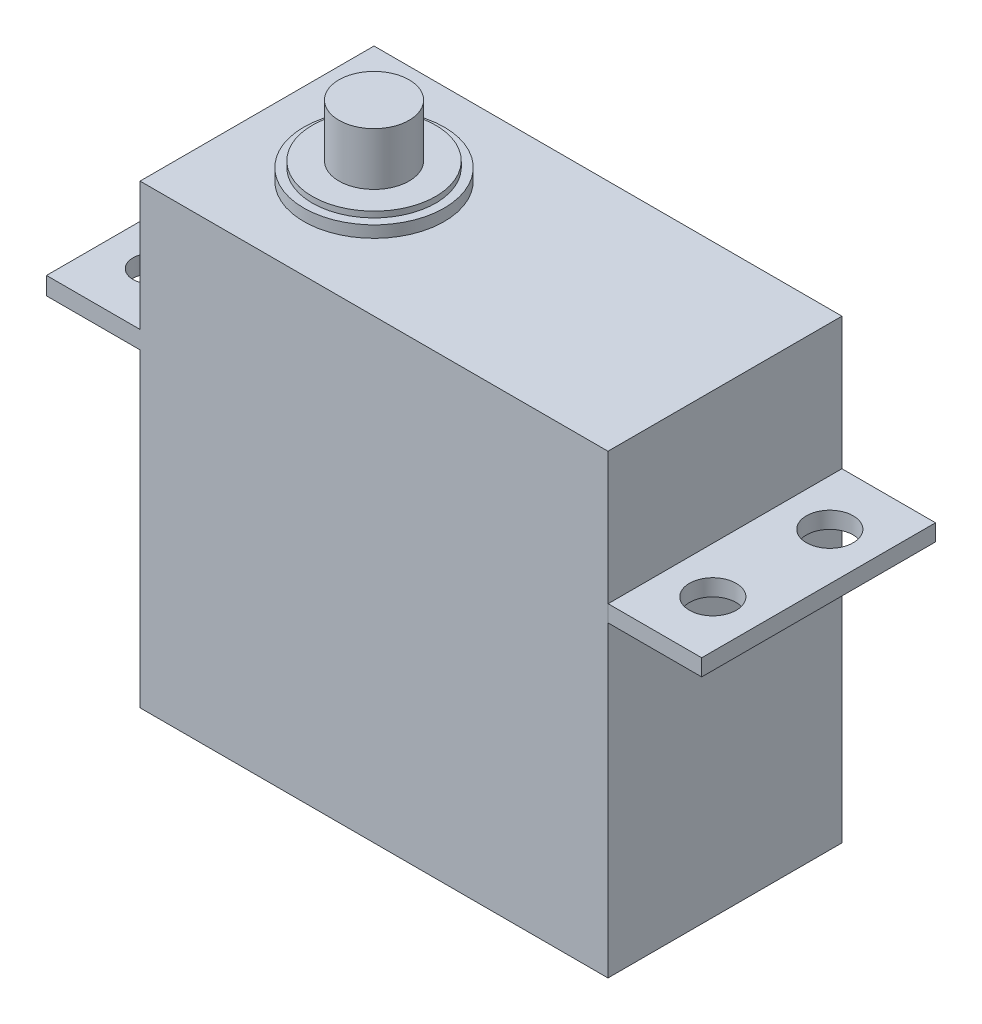
ISO-10303-21;
HEADER;
FILE_DESCRIPTION(('STEP AP214'),'2;1');
FILE_NAME('part.step','',(''),(''),'','','');
FILE_SCHEMA(('AUTOMOTIVE_DESIGN { 1 0 10303 214 1 1 1 1 }'));
ENDSEC;
DATA;
#1=APPLICATION_CONTEXT('core data for automotive mechanical design processes');
#2=APPLICATION_PROTOCOL_DEFINITION('international standard','automotive_design',2000,#1);
#3=PRODUCT_CONTEXT('',#1,'mechanical');
#4=PRODUCT('Part','Part','',(#3));
#5=PRODUCT_RELATED_PRODUCT_CATEGORY('part','',(#4));
#6=PRODUCT_DEFINITION_FORMATION('','',#4);
#7=PRODUCT_DEFINITION_CONTEXT('part definition',#1,'design');
#8=PRODUCT_DEFINITION('design','',#6,#7);
#9=PRODUCT_DEFINITION_SHAPE('','',#8);
#10=(LENGTH_UNIT() NAMED_UNIT(*) SI_UNIT(.MILLI.,.METRE.));
#11=(NAMED_UNIT(*) PLANE_ANGLE_UNIT() SI_UNIT($,.RADIAN.));
#12=(NAMED_UNIT(*) SI_UNIT($,.STERADIAN.) SOLID_ANGLE_UNIT());
#13=UNCERTAINTY_MEASURE_WITH_UNIT(LENGTH_MEASURE(1.E-05),#10,'distance_accuracy_value','');
#14=(GEOMETRIC_REPRESENTATION_CONTEXT(3) GLOBAL_UNCERTAINTY_ASSIGNED_CONTEXT((#13)) GLOBAL_UNIT_ASSIGNED_CONTEXT((#10,
#11,#12)) REPRESENTATION_CONTEXT('',''));
#15=CARTESIAN_POINT('',(0.,0.,0.));
#16=DIRECTION('',(0.,0.,1.));
#17=DIRECTION('',(1.,0.,0.));
#18=AXIS2_PLACEMENT_3D('',#15,#16,#17);
#19=CARTESIAN_POINT('',(20.,19.5,20.));
#20=DIRECTION('',(-1.,0.,0.));
#21=DIRECTION('',(0.,0.,1.));
#22=AXIS2_PLACEMENT_3D('',#19,#20,#21);
#23=PLANE('',#22);
#24=DIRECTION('',(0.,0.,-1.));
#25=VECTOR('',#24,1.);
#26=CARTESIAN_POINT('',(20.,6.78341906356428,0.));
#27=LINE('',#26,#25);
#28=CARTESIAN_POINT('',(20.,6.78341906356428,19.9885357347778));
#29=VERTEX_POINT('',#28);
#30=CARTESIAN_POINT('',(20.,6.78341906356428,0.));
#31=VERTEX_POINT('',#30);
#32=EDGE_CURVE('E62',#29,#31,#27,.T.);
#33=ORIENTED_EDGE('',*,*,#32,.F.);
#34=DIRECTION('',(0.,-1.,0.));
#35=VECTOR('',#34,1.);
#36=CARTESIAN_POINT('',(20.,8.20390468297783,19.9885357347778));
#37=LINE('',#36,#35);
#38=CARTESIAN_POINT('',(20.,8.20390468297783,19.9885357347778));
#39=VERTEX_POINT('',#38);
#40=EDGE_CURVE('E308',#39,#29,#37,.T.);
#41=ORIENTED_EDGE('',*,*,#40,.F.);
#42=DIRECTION('',(0.,0.,1.));
#43=VECTOR('',#42,1.);
#44=CARTESIAN_POINT('',(20.,8.20390468297783,0.));
#45=LINE('',#44,#43);
#46=CARTESIAN_POINT('',(20.,8.20390468297783,0.));
#47=VERTEX_POINT('',#46);
#48=EDGE_CURVE('E68',#47,#39,#45,.T.);
#49=ORIENTED_EDGE('',*,*,#48,.F.);
#50=DIRECTION('',(0.,1.,0.));
#51=VECTOR('',#50,1.);
#52=CARTESIAN_POINT('',(20.,19.5,0.));
#53=LINE('',#52,#51);
#54=CARTESIAN_POINT('',(20.,19.5,0.));
#55=VERTEX_POINT('',#54);
#56=EDGE_CURVE('E160',#47,#55,#53,.T.);
#57=ORIENTED_EDGE('',*,*,#56,.T.);
#58=DIRECTION('',(0.,0.,-1.));
#59=VECTOR('',#58,1.);
#60=CARTESIAN_POINT('',(20.,19.5,20.));
#61=LINE('',#60,#59);
#62=CARTESIAN_POINT('',(20.,19.5,20.));
#63=VERTEX_POINT('',#62);
#64=EDGE_CURVE('E54',#63,#55,#61,.T.);
#65=ORIENTED_EDGE('',*,*,#64,.F.);
#66=DIRECTION('',(0.,1.,0.));
#67=VECTOR('',#66,1.);
#68=CARTESIAN_POINT('',(20.,19.5,20.));
#69=LINE('',#68,#67);
#70=CARTESIAN_POINT('',(20.,-19.5,20.));
#71=VERTEX_POINT('',#70);
#72=EDGE_CURVE('E213',#71,#63,#69,.T.);
#73=ORIENTED_EDGE('',*,*,#72,.F.);
#74=DIRECTION('',(0.,0.,-1.));
#75=VECTOR('',#74,1.);
#76=CARTESIAN_POINT('',(20.,-19.5,20.));
#77=LINE('',#76,#75);
#78=CARTESIAN_POINT('',(20.,-19.5,0.));
#79=VERTEX_POINT('',#78);
#80=EDGE_CURVE('E229',#71,#79,#77,.T.);
#81=ORIENTED_EDGE('',*,*,#80,.T.);
#82=EDGE_CURVE('E230',#79,#31,#53,.T.);
#83=ORIENTED_EDGE('',*,*,#82,.T.);
#84=EDGE_LOOP('',(#33,#41,#49,#57,#65,#73,#81,#83));
#85=FACE_BOUND('',#84,.T.);
#86=ADVANCED_FACE('F45',(#85),#23,.F.);
#87=CARTESIAN_POINT('',(-20.,19.5,20.));
#88=DIRECTION('',(1.,0.,0.));
#89=DIRECTION('',(0.,0.,-1.));
#90=AXIS2_PLACEMENT_3D('',#87,#88,#89);
#91=PLANE('',#90);
#92=DIRECTION('',(0.,0.,-1.));
#93=VECTOR('',#92,1.);
#94=CARTESIAN_POINT('',(-20.,8.51515151515164,0.));
#95=LINE('',#94,#93);
#96=CARTESIAN_POINT('',(-20.,8.51515151515164,20.));
#97=VERTEX_POINT('',#96);
#98=CARTESIAN_POINT('',(-20.,8.51515151515164,0.));
#99=VERTEX_POINT('',#98);
#100=EDGE_CURVE('E167',#97,#99,#95,.T.);
#101=ORIENTED_EDGE('',*,*,#100,.F.);
#102=DIRECTION('',(0.,-1.,0.));
#103=VECTOR('',#102,1.);
#104=CARTESIAN_POINT('',(-20.,19.5,20.));
#105=LINE('',#104,#103);
#106=CARTESIAN_POINT('',(-20.,19.5,20.));
#107=VERTEX_POINT('',#106);
#108=EDGE_CURVE('E222',#107,#97,#105,.T.);
#109=ORIENTED_EDGE('',*,*,#108,.F.);
#110=DIRECTION('',(0.,0.,-1.));
#111=VECTOR('',#110,1.);
#112=CARTESIAN_POINT('',(-20.,19.5,20.));
#113=LINE('',#112,#111);
#114=CARTESIAN_POINT('',(-20.,19.5,0.));
#115=VERTEX_POINT('',#114);
#116=EDGE_CURVE('E249',#107,#115,#113,.T.);
#117=ORIENTED_EDGE('',*,*,#116,.T.);
#118=DIRECTION('',(0.,-1.,0.));
#119=VECTOR('',#118,1.);
#120=CARTESIAN_POINT('',(-20.,19.5,0.));
#121=LINE('',#120,#119);
#122=EDGE_CURVE('E237',#115,#99,#121,.T.);
#123=ORIENTED_EDGE('',*,*,#122,.T.);
#124=EDGE_LOOP('',(#101,#109,#117,#123));
#125=FACE_BOUND('',#124,.T.);
#126=ADVANCED_FACE('F322',(#125),#91,.F.);
#127=DIRECTION('',(0.,0.,1.));
#128=VECTOR('',#127,1.);
#129=CARTESIAN_POINT('',(-20.,7.00000000000013,0.));
#130=LINE('',#129,#128);
#131=CARTESIAN_POINT('',(-20.,7.00000000000013,0.));
#132=VERTEX_POINT('',#131);
#133=CARTESIAN_POINT('',(-20.,7.00000000000013,20.));
#134=VERTEX_POINT('',#133);
#135=EDGE_CURVE('E162',#132,#134,#130,.T.);
#136=ORIENTED_EDGE('',*,*,#135,.F.);
#137=CARTESIAN_POINT('',(-20.,-19.5,0.));
#138=VERTEX_POINT('',#137);
#139=EDGE_CURVE('E236',#132,#138,#121,.T.);
#140=ORIENTED_EDGE('',*,*,#139,.T.);
#141=DIRECTION('',(0.,0.,-1.));
#142=VECTOR('',#141,1.);
#143=CARTESIAN_POINT('',(-20.,-19.5,20.));
#144=LINE('',#143,#142);
#145=CARTESIAN_POINT('',(-20.,-19.5,20.));
#146=VERTEX_POINT('',#145);
#147=EDGE_CURVE('E245',#146,#138,#144,.T.);
#148=ORIENTED_EDGE('',*,*,#147,.F.);
#149=EDGE_CURVE('E221',#134,#146,#105,.T.);
#150=ORIENTED_EDGE('',*,*,#149,.F.);
#151=EDGE_LOOP('',(#136,#140,#148,#150));
#152=FACE_BOUND('',#151,.T.);
#153=ADVANCED_FACE('F328',(#152),#91,.F.);
#154=CARTESIAN_POINT('',(-20.,19.5,20.));
#155=DIRECTION('',(0.,-1.,0.));
#156=DIRECTION('',(0.,0.,-1.));
#157=AXIS2_PLACEMENT_3D('',#154,#155,#156);
#158=PLANE('',#157);
#159=CARTESIAN_POINT('',(-10.,19.5,10.));
#160=DIRECTION('',(0.,-1.,0.));
#161=DIRECTION('',(0.,0.,-1.));
#162=AXIS2_PLACEMENT_3D('',#159,#160,#161);
#163=CIRCLE('',#162,6.);
#164=CARTESIAN_POINT('',(-10.,19.5,4.));
#165=VERTEX_POINT('',#164);
#166=EDGE_CURVE('E11',#165,#165,#163,.F.);
#167=ORIENTED_EDGE('',*,*,#166,.F.);
#168=EDGE_LOOP('',(#167));
#169=FACE_BOUND('',#168,.T.);
#170=DIRECTION('',(-1.,0.,0.));
#171=VECTOR('',#170,1.);
#172=CARTESIAN_POINT('',(-20.,19.5,0.));
#173=LINE('',#172,#171);
#174=EDGE_CURVE('E233',#55,#115,#173,.T.);
#175=ORIENTED_EDGE('',*,*,#174,.T.);
#176=ORIENTED_EDGE('',*,*,#116,.F.);
#177=DIRECTION('',(-1.,0.,0.));
#178=VECTOR('',#177,1.);
#179=CARTESIAN_POINT('',(-20.,19.5,20.));
#180=LINE('',#179,#178);
#181=EDGE_CURVE('E217',#63,#107,#180,.T.);
#182=ORIENTED_EDGE('',*,*,#181,.F.);
#183=ORIENTED_EDGE('',*,*,#64,.T.);
#184=EDGE_LOOP('',(#175,#176,#182,#183));
#185=FACE_BOUND('',#184,.T.);
#186=ADVANCED_FACE('F335',(#169,#185),#158,.F.);
#187=CARTESIAN_POINT('',(-20.,-19.5,20.));
#188=DIRECTION('',(0.,1.,0.));
#189=DIRECTION('',(0.,0.,1.));
#190=AXIS2_PLACEMENT_3D('',#187,#188,#189);
#191=PLANE('',#190);
#192=DIRECTION('',(1.,0.,0.));
#193=VECTOR('',#192,1.);
#194=CARTESIAN_POINT('',(-20.,-19.5,0.));
#195=LINE('',#194,#193);
#196=EDGE_CURVE('E218',#138,#79,#195,.T.);
#197=ORIENTED_EDGE('',*,*,#196,.T.);
#198=ORIENTED_EDGE('',*,*,#80,.F.);
#199=DIRECTION('',(1.,0.,0.));
#200=VECTOR('',#199,1.);
#201=CARTESIAN_POINT('',(-20.,-19.5,20.));
#202=LINE('',#201,#200);
#203=EDGE_CURVE('E226',#146,#71,#202,.T.);
#204=ORIENTED_EDGE('',*,*,#203,.F.);
#205=ORIENTED_EDGE('',*,*,#147,.T.);
#206=EDGE_LOOP('',(#197,#198,#204,#205));
#207=FACE_BOUND('',#206,.T.);
#208=ADVANCED_FACE('F338',(#207),#191,.F.);
#209=CARTESIAN_POINT('',(0.,0.,20.));
#210=DIRECTION('',(0.,0.,1.));
#211=DIRECTION('',(1.,0.,0.));
#212=AXIS2_PLACEMENT_3D('',#209,#210,#211);
#213=PLANE('',#212);
#214=ORIENTED_EDGE('',*,*,#72,.T.);
#215=ORIENTED_EDGE('',*,*,#181,.T.);
#216=ORIENTED_EDGE('',*,*,#108,.T.);
#217=DIRECTION('',(1.,0.,0.));
#218=VECTOR('',#217,1.);
#219=CARTESIAN_POINT('',(-28.,8.51515151515164,20.));
#220=LINE('',#219,#218);
#221=CARTESIAN_POINT('',(-28.,8.51515151515164,20.));
#222=VERTEX_POINT('',#221);
#223=EDGE_CURVE('E193',#222,#97,#220,.T.);
#224=ORIENTED_EDGE('',*,*,#223,.F.);
#225=DIRECTION('',(0.,1.,0.));
#226=VECTOR('',#225,1.);
#227=CARTESIAN_POINT('',(-28.,8.51515151515164,20.));
#228=LINE('',#227,#226);
#229=CARTESIAN_POINT('',(-28.,7.00000000000013,20.));
#230=VERTEX_POINT('',#229);
#231=EDGE_CURVE('E180',#230,#222,#228,.T.);
#232=ORIENTED_EDGE('',*,*,#231,.F.);
#233=DIRECTION('',(1.,0.,0.));
#234=VECTOR('',#233,1.);
#235=CARTESIAN_POINT('',(-28.,7.00000000000013,20.));
#236=LINE('',#235,#234);
#237=EDGE_CURVE('E197',#230,#134,#236,.T.);
#238=ORIENTED_EDGE('',*,*,#237,.T.);
#239=ORIENTED_EDGE('',*,*,#149,.T.);
#240=ORIENTED_EDGE('',*,*,#203,.T.);
#241=EDGE_LOOP('',(#214,#215,#216,#224,#232,#238,#239,#240));
#242=FACE_BOUND('',#241,.T.);
#243=ADVANCED_FACE('F346',(#242),#213,.T.);
#244=CARTESIAN_POINT('',(0.,0.,0.));
#245=DIRECTION('',(0.,0.,1.));
#246=DIRECTION('',(1.,0.,0.));
#247=AXIS2_PLACEMENT_3D('',#244,#245,#246);
#248=PLANE('',#247);
#249=ORIENTED_EDGE('',*,*,#82,.F.);
#250=ORIENTED_EDGE('',*,*,#196,.F.);
#251=ORIENTED_EDGE('',*,*,#139,.F.);
#252=DIRECTION('',(1.,0.,0.));
#253=VECTOR('',#252,1.);
#254=CARTESIAN_POINT('',(-28.,7.00000000000013,0.));
#255=LINE('',#254,#253);
#256=CARTESIAN_POINT('',(-28.,7.00000000000013,0.));
#257=VERTEX_POINT('',#256);
#258=EDGE_CURVE('E201',#257,#132,#255,.T.);
#259=ORIENTED_EDGE('',*,*,#258,.F.);
#260=DIRECTION('',(0.,-1.,0.));
#261=VECTOR('',#260,1.);
#262=CARTESIAN_POINT('',(-28.,8.51515151515164,0.));
#263=LINE('',#262,#261);
#264=CARTESIAN_POINT('',(-28.,8.51515151515164,0.));
#265=VERTEX_POINT('',#264);
#266=EDGE_CURVE('E173',#265,#257,#263,.T.);
#267=ORIENTED_EDGE('',*,*,#266,.F.);
#268=DIRECTION('',(1.,0.,0.));
#269=VECTOR('',#268,1.);
#270=CARTESIAN_POINT('',(-28.,8.51515151515164,0.));
#271=LINE('',#270,#269);
#272=EDGE_CURVE('E185',#265,#99,#271,.T.);
#273=ORIENTED_EDGE('',*,*,#272,.T.);
#274=ORIENTED_EDGE('',*,*,#122,.F.);
#275=ORIENTED_EDGE('',*,*,#174,.F.);
#276=ORIENTED_EDGE('',*,*,#56,.F.);
#277=DIRECTION('',(-1.,0.,0.));
#278=VECTOR('',#277,1.);
#279=CARTESIAN_POINT('',(28.,8.20390468297783,0.));
#280=LINE('',#279,#278);
#281=CARTESIAN_POINT('',(28.,8.20390468297783,0.));
#282=VERTEX_POINT('',#281);
#283=EDGE_CURVE('E139',#282,#47,#280,.T.);
#284=ORIENTED_EDGE('',*,*,#283,.F.);
#285=DIRECTION('',(0.,1.,0.));
#286=VECTOR('',#285,1.);
#287=CARTESIAN_POINT('',(28.,8.20390468297783,0.));
#288=LINE('',#287,#286);
#289=CARTESIAN_POINT('',(28.,6.78341906356428,0.));
#290=VERTEX_POINT('',#289);
#291=EDGE_CURVE('E146',#290,#282,#288,.T.);
#292=ORIENTED_EDGE('',*,*,#291,.F.);
#293=DIRECTION('',(-1.,0.,0.));
#294=VECTOR('',#293,1.);
#295=CARTESIAN_POINT('',(28.,6.78341906356428,0.));
#296=LINE('',#295,#294);
#297=EDGE_CURVE('E305',#290,#31,#296,.T.);
#298=ORIENTED_EDGE('',*,*,#297,.T.);
#299=EDGE_LOOP('',(#249,#250,#251,#259,#267,#273,#274,#275,#276,#284,#292,#298));
#300=FACE_BOUND('',#299,.T.);
#301=ADVANCED_FACE('F158',(#300),#248,.F.);
#302=CARTESIAN_POINT('',(-10.,20.5,10.));
#303=DIRECTION('',(0.,-1.,0.));
#304=DIRECTION('',(0.,0.,-1.));
#305=AXIS2_PLACEMENT_3D('',#302,#303,#304);
#306=CYLINDRICAL_SURFACE('',#305,6.);
#307=CARTESIAN_POINT('',(-10.,20.5,10.));
#308=DIRECTION('',(0.,1.,0.));
#309=DIRECTION('',(0.,0.,1.));
#310=AXIS2_PLACEMENT_3D('',#307,#308,#309);
#311=CIRCLE('',#310,6.);
#312=CARTESIAN_POINT('',(-10.,20.5,16.));
#313=VERTEX_POINT('',#312);
#314=EDGE_CURVE('E209',#313,#313,#311,.T.);
#315=ORIENTED_EDGE('',*,*,#314,.F.);
#316=EDGE_LOOP('',(#315));
#317=FACE_BOUND('',#316,.T.);
#318=ORIENTED_EDGE('',*,*,#166,.T.);
#319=EDGE_LOOP('',(#318));
#320=FACE_BOUND('',#319,.T.);
#321=ADVANCED_FACE('F402',(#317,#320),#306,.T.);
#322=CARTESIAN_POINT('',(-10.,20.5,10.));
#323=DIRECTION('',(0.,1.,0.));
#324=DIRECTION('',(0.,0.,1.));
#325=AXIS2_PLACEMENT_3D('',#322,#323,#324);
#326=PLANE('',#325);
#327=CARTESIAN_POINT('',(-10.,20.5,10.));
#328=DIRECTION('',(0.,1.,0.));
#329=DIRECTION('',(0.,0.,1.));
#330=AXIS2_PLACEMENT_3D('',#327,#328,#329);
#331=CIRCLE('',#330,5.27379499582765);
#332=CARTESIAN_POINT('',(-10.,20.5,15.2737949958276));
#333=VERTEX_POINT('',#332);
#334=EDGE_CURVE('E48',#333,#333,#331,.F.);
#335=ORIENTED_EDGE('',*,*,#334,.T.);
#336=EDGE_LOOP('',(#335));
#337=FACE_BOUND('',#336,.T.);
#338=ORIENTED_EDGE('',*,*,#314,.T.);
#339=EDGE_LOOP('',(#338));
#340=FACE_BOUND('',#339,.T.);
#341=ADVANCED_FACE('F391',(#337,#340),#326,.T.);
#342=CARTESIAN_POINT('',(-28.,7.00000000000013,0.));
#343=DIRECTION('',(0.,1.,0.));
#344=DIRECTION('',(0.,0.,1.));
#345=AXIS2_PLACEMENT_3D('',#342,#343,#344);
#346=PLANE('',#345);
#347=CARTESIAN_POINT('',(-24.,7.00000000000013,15.));
#348=DIRECTION('',(0.,1.,0.));
#349=DIRECTION('',(0.,0.,1.));
#350=AXIS2_PLACEMENT_3D('',#347,#348,#349);
#351=CIRCLE('',#350,1.60461882318389);
#352=CARTESIAN_POINT('',(-24.,7.00000000000013,16.6046188231839));
#353=VERTEX_POINT('',#352);
#354=EDGE_CURVE('E297',#353,#353,#351,.T.);
#355=ORIENTED_EDGE('',*,*,#354,.T.);
#356=EDGE_LOOP('',(#355));
#357=FACE_BOUND('',#356,.T.);
#358=CARTESIAN_POINT('',(-24.,7.00000000000013,5.));
#359=DIRECTION('',(0.,1.,0.));
#360=DIRECTION('',(0.,0.,1.));
#361=AXIS2_PLACEMENT_3D('',#358,#359,#360);
#362=CIRCLE('',#361,1.71046859392092);
#363=CARTESIAN_POINT('',(-24.,7.00000000000013,6.71046859392093));
#364=VERTEX_POINT('',#363);
#365=EDGE_CURVE('E293',#364,#364,#362,.T.);
#366=ORIENTED_EDGE('',*,*,#365,.T.);
#367=EDGE_LOOP('',(#366));
#368=FACE_BOUND('',#367,.T.);
#369=ORIENTED_EDGE('',*,*,#135,.T.);
#370=ORIENTED_EDGE('',*,*,#237,.F.);
#371=DIRECTION('',(0.,0.,1.));
#372=VECTOR('',#371,1.);
#373=CARTESIAN_POINT('',(-28.,7.00000000000013,0.));
#374=LINE('',#373,#372);
#375=EDGE_CURVE('E177',#257,#230,#374,.T.);
#376=ORIENTED_EDGE('',*,*,#375,.F.);
#377=ORIENTED_EDGE('',*,*,#258,.T.);
#378=EDGE_LOOP('',(#369,#370,#376,#377));
#379=FACE_BOUND('',#378,.T.);
#380=ADVANCED_FACE('F374',(#357,#368,#379),#346,.F.);
#381=CARTESIAN_POINT('',(-28.,8.51515151515164,0.));
#382=DIRECTION('',(0.,-1.,0.));
#383=DIRECTION('',(0.,0.,-1.));
#384=AXIS2_PLACEMENT_3D('',#381,#382,#383);
#385=PLANE('',#384);
#386=CARTESIAN_POINT('',(-24.,8.51515151515164,15.));
#387=DIRECTION('',(0.,1.,0.));
#388=DIRECTION('',(0.,0.,1.));
#389=AXIS2_PLACEMENT_3D('',#386,#387,#388);
#390=CIRCLE('',#389,1.60461882318389);
#391=CARTESIAN_POINT('',(-24.,8.51515151515164,16.6046188231839));
#392=VERTEX_POINT('',#391);
#393=EDGE_CURVE('E275',#392,#392,#390,.T.);
#394=ORIENTED_EDGE('',*,*,#393,.F.);
#395=EDGE_LOOP('',(#394));
#396=FACE_BOUND('',#395,.T.);
#397=CARTESIAN_POINT('',(-24.,8.51515151515164,5.));
#398=DIRECTION('',(0.,1.,0.));
#399=DIRECTION('',(0.,0.,1.));
#400=AXIS2_PLACEMENT_3D('',#397,#398,#399);
#401=CIRCLE('',#400,1.71046859392092);
#402=CARTESIAN_POINT('',(-24.,8.51515151515164,6.71046859392093));
#403=VERTEX_POINT('',#402);
#404=EDGE_CURVE('E261',#403,#403,#401,.T.);
#405=ORIENTED_EDGE('',*,*,#404,.F.);
#406=EDGE_LOOP('',(#405));
#407=FACE_BOUND('',#406,.T.);
#408=ORIENTED_EDGE('',*,*,#100,.T.);
#409=ORIENTED_EDGE('',*,*,#272,.F.);
#410=DIRECTION('',(0.,0.,-1.));
#411=VECTOR('',#410,1.);
#412=CARTESIAN_POINT('',(-28.,8.51515151515164,0.));
#413=LINE('',#412,#411);
#414=EDGE_CURVE('E183',#222,#265,#413,.T.);
#415=ORIENTED_EDGE('',*,*,#414,.F.);
#416=ORIENTED_EDGE('',*,*,#223,.T.);
#417=EDGE_LOOP('',(#408,#409,#415,#416));
#418=FACE_BOUND('',#417,.T.);
#419=ADVANCED_FACE('F359',(#396,#407,#418),#385,.F.);
#420=CARTESIAN_POINT('',(-28.,0.,0.));
#421=DIRECTION('',(-1.,0.,0.));
#422=DIRECTION('',(0.,0.,1.));
#423=AXIS2_PLACEMENT_3D('',#420,#421,#422);
#424=PLANE('',#423);
#425=ORIENTED_EDGE('',*,*,#266,.T.);
#426=ORIENTED_EDGE('',*,*,#375,.T.);
#427=ORIENTED_EDGE('',*,*,#231,.T.);
#428=ORIENTED_EDGE('',*,*,#414,.T.);
#429=EDGE_LOOP('',(#425,#426,#427,#428));
#430=FACE_BOUND('',#429,.T.);
#431=ADVANCED_FACE('F376',(#430),#424,.T.);
#432=CARTESIAN_POINT('',(28.,8.20390468297783,0.));
#433=DIRECTION('',(0.,-1.,0.));
#434=DIRECTION('',(0.,0.,-1.));
#435=AXIS2_PLACEMENT_3D('',#432,#433,#434);
#436=PLANE('',#435);
#437=CARTESIAN_POINT('',(23.96322472814,8.20390468297783,5.));
#438=DIRECTION('',(0.,-1.,0.));
#439=DIRECTION('',(0.,0.,-1.));
#440=AXIS2_PLACEMENT_3D('',#437,#438,#439);
#441=CIRCLE('',#440,2.);
#442=CARTESIAN_POINT('',(23.96322472814,8.20390468297783,3.));
#443=VERTEX_POINT('',#442);
#444=EDGE_CURVE('E265',#443,#443,#441,.T.);
#445=ORIENTED_EDGE('',*,*,#444,.T.);
#446=EDGE_LOOP('',(#445));
#447=FACE_BOUND('',#446,.T.);
#448=CARTESIAN_POINT('',(23.96322472814,8.20390468297783,15.));
#449=DIRECTION('',(0.,-1.,0.));
#450=DIRECTION('',(0.,0.,-1.));
#451=AXIS2_PLACEMENT_3D('',#448,#449,#450);
#452=CIRCLE('',#451,2.);
#453=CARTESIAN_POINT('',(23.96322472814,8.20390468297783,13.));
#454=VERTEX_POINT('',#453);
#455=EDGE_CURVE('E260',#454,#454,#452,.T.);
#456=ORIENTED_EDGE('',*,*,#455,.T.);
#457=EDGE_LOOP('',(#456));
#458=FACE_BOUND('',#457,.T.);
#459=ORIENTED_EDGE('',*,*,#48,.T.);
#460=DIRECTION('',(-1.,0.,0.));
#461=VECTOR('',#460,1.);
#462=CARTESIAN_POINT('',(28.,8.20390468297783,19.9885357347778));
#463=LINE('',#462,#461);
#464=CARTESIAN_POINT('',(28.,8.20390468297783,19.9885357347778));
#465=VERTEX_POINT('',#464);
#466=EDGE_CURVE('E141',#465,#39,#463,.T.);
#467=ORIENTED_EDGE('',*,*,#466,.F.);
#468=DIRECTION('',(0.,0.,1.));
#469=VECTOR('',#468,1.);
#470=CARTESIAN_POINT('',(28.,8.20390468297783,0.));
#471=LINE('',#470,#469);
#472=EDGE_CURVE('E135',#282,#465,#471,.T.);
#473=ORIENTED_EDGE('',*,*,#472,.F.);
#474=ORIENTED_EDGE('',*,*,#283,.T.);
#475=EDGE_LOOP('',(#459,#467,#473,#474));
#476=FACE_BOUND('',#475,.T.);
#477=ADVANCED_FACE('F137',(#447,#458,#476),#436,.F.);
#478=CARTESIAN_POINT('',(28.,8.20390468297783,19.9885357347778));
#479=DIRECTION('',(0.,0.,-1.));
#480=DIRECTION('',(-1.,0.,0.));
#481=AXIS2_PLACEMENT_3D('',#478,#479,#480);
#482=PLANE('',#481);
#483=ORIENTED_EDGE('',*,*,#40,.T.);
#484=DIRECTION('',(-1.,0.,0.));
#485=VECTOR('',#484,1.);
#486=CARTESIAN_POINT('',(28.,6.78341906356428,19.9885357347778));
#487=LINE('',#486,#485);
#488=CARTESIAN_POINT('',(28.,6.78341906356428,19.9885357347778));
#489=VERTEX_POINT('',#488);
#490=EDGE_CURVE('E169',#489,#29,#487,.T.);
#491=ORIENTED_EDGE('',*,*,#490,.F.);
#492=DIRECTION('',(0.,-1.,0.));
#493=VECTOR('',#492,1.);
#494=CARTESIAN_POINT('',(28.,8.20390468297783,19.9885357347778));
#495=LINE('',#494,#493);
#496=EDGE_CURVE('E145',#465,#489,#495,.T.);
#497=ORIENTED_EDGE('',*,*,#496,.F.);
#498=ORIENTED_EDGE('',*,*,#466,.T.);
#499=EDGE_LOOP('',(#483,#491,#497,#498));
#500=FACE_BOUND('',#499,.T.);
#501=ADVANCED_FACE('F320',(#500),#482,.F.);
#502=CARTESIAN_POINT('',(28.,6.78341906356428,0.));
#503=DIRECTION('',(0.,1.,0.));
#504=DIRECTION('',(0.,0.,1.));
#505=AXIS2_PLACEMENT_3D('',#502,#503,#504);
#506=PLANE('',#505);
#507=CARTESIAN_POINT('',(23.96322472814,6.78341906356428,5.));
#508=DIRECTION('',(0.,1.,0.));
#509=DIRECTION('',(0.,0.,1.));
#510=AXIS2_PLACEMENT_3D('',#507,#508,#509);
#511=CIRCLE('',#510,2.);
#512=CARTESIAN_POINT('',(23.96322472814,6.78341906356428,7.));
#513=VERTEX_POINT('',#512);
#514=EDGE_CURVE('E262',#513,#513,#511,.T.);
#515=ORIENTED_EDGE('',*,*,#514,.T.);
#516=EDGE_LOOP('',(#515));
#517=FACE_BOUND('',#516,.T.);
#518=CARTESIAN_POINT('',(23.96322472814,6.78341906356428,15.));
#519=DIRECTION('',(0.,1.,0.));
#520=DIRECTION('',(0.,0.,1.));
#521=AXIS2_PLACEMENT_3D('',#518,#519,#520);
#522=CIRCLE('',#521,2.);
#523=CARTESIAN_POINT('',(23.96322472814,6.78341906356428,17.));
#524=VERTEX_POINT('',#523);
#525=EDGE_CURVE('E256',#524,#524,#522,.T.);
#526=ORIENTED_EDGE('',*,*,#525,.T.);
#527=EDGE_LOOP('',(#526));
#528=FACE_BOUND('',#527,.T.);
#529=ORIENTED_EDGE('',*,*,#32,.T.);
#530=ORIENTED_EDGE('',*,*,#297,.F.);
#531=DIRECTION('',(0.,0.,-1.));
#532=VECTOR('',#531,1.);
#533=CARTESIAN_POINT('',(28.,6.78341906356428,0.));
#534=LINE('',#533,#532);
#535=EDGE_CURVE('E151',#489,#290,#534,.T.);
#536=ORIENTED_EDGE('',*,*,#535,.F.);
#537=ORIENTED_EDGE('',*,*,#490,.T.);
#538=EDGE_LOOP('',(#529,#530,#536,#537));
#539=FACE_BOUND('',#538,.T.);
#540=ADVANCED_FACE('F318',(#517,#528,#539),#506,.F.);
#541=CARTESIAN_POINT('',(28.,0.,0.));
#542=DIRECTION('',(-1.,0.,0.));
#543=DIRECTION('',(0.,0.,1.));
#544=AXIS2_PLACEMENT_3D('',#541,#542,#543);
#545=PLANE('',#544);
#546=ORIENTED_EDGE('',*,*,#291,.T.);
#547=ORIENTED_EDGE('',*,*,#472,.T.);
#548=ORIENTED_EDGE('',*,*,#496,.T.);
#549=ORIENTED_EDGE('',*,*,#535,.T.);
#550=EDGE_LOOP('',(#546,#547,#548,#549));
#551=FACE_BOUND('',#550,.T.);
#552=ADVANCED_FACE('F149',(#551),#545,.F.);
#553=CARTESIAN_POINT('',(23.96322472814,5.51515151515164,15.));
#554=DIRECTION('',(0.,1.,0.));
#555=DIRECTION('',(0.,0.,1.));
#556=AXIS2_PLACEMENT_3D('',#553,#554,#555);
#557=CYLINDRICAL_SURFACE('',#556,2.);
#558=ORIENTED_EDGE('',*,*,#525,.F.);
#559=EDGE_LOOP('',(#558));
#560=FACE_BOUND('',#559,.T.);
#561=ORIENTED_EDGE('',*,*,#455,.F.);
#562=EDGE_LOOP('',(#561));
#563=FACE_BOUND('',#562,.T.);
#564=ADVANCED_FACE('F423',(#560,#563),#557,.F.);
#565=CARTESIAN_POINT('',(23.96322472814,5.51515151515164,5.));
#566=DIRECTION('',(0.,1.,0.));
#567=DIRECTION('',(0.,0.,1.));
#568=AXIS2_PLACEMENT_3D('',#565,#566,#567);
#569=CYLINDRICAL_SURFACE('',#568,2.);
#570=ORIENTED_EDGE('',*,*,#514,.F.);
#571=EDGE_LOOP('',(#570));
#572=FACE_BOUND('',#571,.T.);
#573=ORIENTED_EDGE('',*,*,#444,.F.);
#574=EDGE_LOOP('',(#573));
#575=FACE_BOUND('',#574,.T.);
#576=ADVANCED_FACE('F453',(#572,#575),#569,.F.);
#577=CARTESIAN_POINT('',(-24.,5.51515151515164,5.));
#578=DIRECTION('',(0.,1.,0.));
#579=DIRECTION('',(0.,0.,1.));
#580=AXIS2_PLACEMENT_3D('',#577,#578,#579);
#581=CYLINDRICAL_SURFACE('',#580,1.71046859392092);
#582=ORIENTED_EDGE('',*,*,#404,.T.);
#583=EDGE_LOOP('',(#582));
#584=FACE_BOUND('',#583,.T.);
#585=ORIENTED_EDGE('',*,*,#365,.F.);
#586=EDGE_LOOP('',(#585));
#587=FACE_BOUND('',#586,.T.);
#588=ADVANCED_FACE('F462',(#584,#587),#581,.F.);
#589=CARTESIAN_POINT('',(-24.,5.51515151515164,15.));
#590=DIRECTION('',(0.,1.,0.));
#591=DIRECTION('',(0.,0.,1.));
#592=AXIS2_PLACEMENT_3D('',#589,#590,#591);
#593=CYLINDRICAL_SURFACE('',#592,1.60461882318389);
#594=ORIENTED_EDGE('',*,*,#393,.T.);
#595=EDGE_LOOP('',(#594));
#596=FACE_BOUND('',#595,.T.);
#597=ORIENTED_EDGE('',*,*,#354,.F.);
#598=EDGE_LOOP('',(#597));
#599=FACE_BOUND('',#598,.T.);
#600=ADVANCED_FACE('F471',(#596,#599),#593,.F.);
#601=CARTESIAN_POINT('',(-10.,21.,10.));
#602=DIRECTION('',(0.,-1.,0.));
#603=DIRECTION('',(0.,0.,-1.));
#604=AXIS2_PLACEMENT_3D('',#601,#602,#603);
#605=CYLINDRICAL_SURFACE('',#604,5.27379499582765);
#606=ORIENTED_EDGE('',*,*,#334,.F.);
#607=EDGE_LOOP('',(#606));
#608=FACE_BOUND('',#607,.T.);
#609=CARTESIAN_POINT('',(-10.,21.,10.));
#610=DIRECTION('',(0.,1.,0.));
#611=DIRECTION('',(0.,0.,1.));
#612=AXIS2_PLACEMENT_3D('',#609,#610,#611);
#613=CIRCLE('',#612,5.27379499582765);
#614=CARTESIAN_POINT('',(-10.,21.,15.2737949958276));
#615=VERTEX_POINT('',#614);
#616=EDGE_CURVE('E269',#615,#615,#613,.T.);
#617=ORIENTED_EDGE('',*,*,#616,.F.);
#618=EDGE_LOOP('',(#617));
#619=FACE_BOUND('',#618,.T.);
#620=ADVANCED_FACE('F479',(#608,#619),#605,.T.);
#621=CARTESIAN_POINT('',(-10.,21.,10.));
#622=DIRECTION('',(0.,1.,0.));
#623=DIRECTION('',(0.,0.,1.));
#624=AXIS2_PLACEMENT_3D('',#621,#622,#623);
#625=PLANE('',#624);
#626=CARTESIAN_POINT('',(-10.,21.,10.));
#627=DIRECTION('',(0.,1.,0.));
#628=DIRECTION('',(0.,0.,1.));
#629=AXIS2_PLACEMENT_3D('',#626,#627,#628);
#630=CIRCLE('',#629,3.);
#631=CARTESIAN_POINT('',(-10.,21.,13.));
#632=VERTEX_POINT('',#631);
#633=EDGE_CURVE('E266',#632,#632,#630,.T.);
#634=ORIENTED_EDGE('',*,*,#633,.F.);
#635=EDGE_LOOP('',(#634));
#636=FACE_BOUND('',#635,.T.);
#637=ORIENTED_EDGE('',*,*,#616,.T.);
#638=EDGE_LOOP('',(#637));
#639=FACE_BOUND('',#638,.T.);
#640=ADVANCED_FACE('F396',(#636,#639),#625,.T.);
#641=CARTESIAN_POINT('',(-10.,25.5,10.));
#642=DIRECTION('',(0.,1.,0.));
#643=DIRECTION('',(0.,0.,1.));
#644=AXIS2_PLACEMENT_3D('',#641,#642,#643);
#645=PLANE('',#644);
#646=CARTESIAN_POINT('',(-10.,25.5,10.));
#647=DIRECTION('',(0.,1.,0.));
#648=DIRECTION('',(0.,0.,1.));
#649=AXIS2_PLACEMENT_3D('',#646,#647,#648);
#650=CIRCLE('',#649,3.);
#651=CARTESIAN_POINT('',(-10.,25.5,13.));
#652=VERTEX_POINT('',#651);
#653=EDGE_CURVE('E205',#652,#652,#650,.T.);
#654=ORIENTED_EDGE('',*,*,#653,.T.);
#655=EDGE_LOOP('',(#654));
#656=FACE_BOUND('',#655,.T.);
#657=ADVANCED_FACE('F393',(#656),#645,.T.);
#658=CARTESIAN_POINT('',(-10.,25.5,10.));
#659=DIRECTION('',(0.,-1.,0.));
#660=DIRECTION('',(0.,0.,-1.));
#661=AXIS2_PLACEMENT_3D('',#658,#659,#660);
#662=CYLINDRICAL_SURFACE('',#661,3.);
#663=ORIENTED_EDGE('',*,*,#633,.T.);
#664=EDGE_LOOP('',(#663));
#665=FACE_BOUND('',#664,.T.);
#666=ORIENTED_EDGE('',*,*,#653,.F.);
#667=EDGE_LOOP('',(#666));
#668=FACE_BOUND('',#667,.T.);
#669=ADVANCED_FACE('F395',(#665,#668),#662,.T.);
#670=CLOSED_SHELL('',(#86,#126,#153,#186,#208,#243,#301,#321,#341,#380,#419,#431,#477,#501,#540,
#552,#564,#576,#588,#600,#620,#640,#657,#669));
#671=MANIFOLD_SOLID_BREP('B2',#670);
#672=ADVANCED_BREP_SHAPE_REPRESENTATION('',(#18,#671),#14);
#673=SHAPE_DEFINITION_REPRESENTATION(#9,#672);
ENDSEC;
END-ISO-10303-21;
